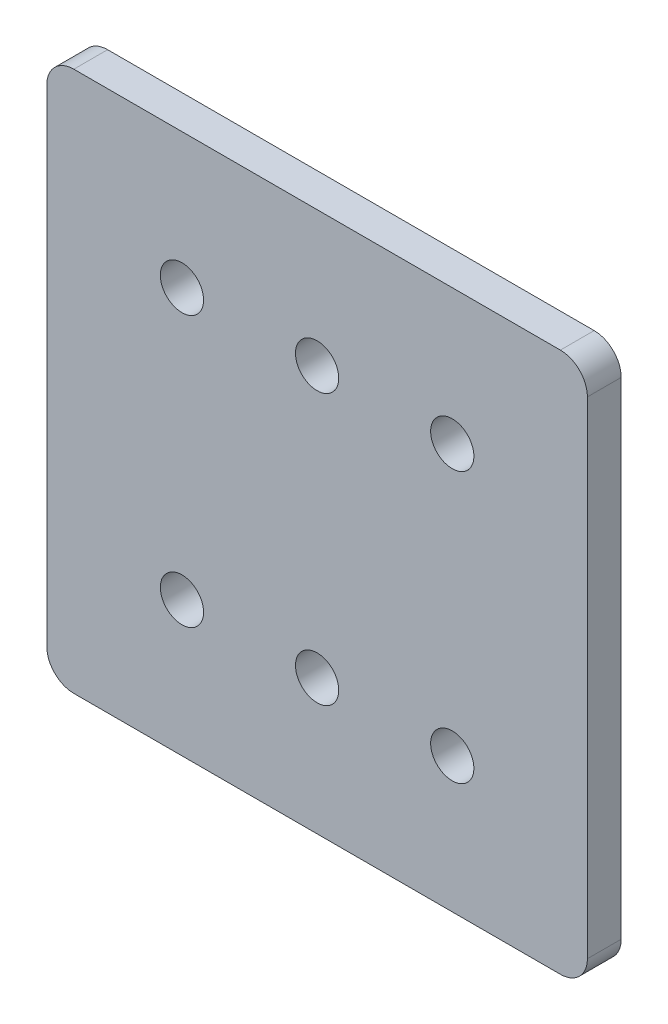
ISO-10303-21;
HEADER;
FILE_DESCRIPTION(('STEP AP214'),'2;1');
FILE_NAME('part.step','',(''),(''),'','','');
FILE_SCHEMA(('AUTOMOTIVE_DESIGN { 1 0 10303 214 1 1 1 1 }'));
ENDSEC;
DATA;
#1=APPLICATION_CONTEXT('core data for automotive mechanical design processes');
#2=APPLICATION_PROTOCOL_DEFINITION('international standard','automotive_design',2000,#1);
#3=PRODUCT_CONTEXT('',#1,'mechanical');
#4=PRODUCT('Part','Part','',(#3));
#5=PRODUCT_RELATED_PRODUCT_CATEGORY('part','',(#4));
#6=PRODUCT_DEFINITION_FORMATION('','',#4);
#7=PRODUCT_DEFINITION_CONTEXT('part definition',#1,'design');
#8=PRODUCT_DEFINITION('design','',#6,#7);
#9=PRODUCT_DEFINITION_SHAPE('','',#8);
#10=(LENGTH_UNIT() NAMED_UNIT(*) SI_UNIT(.MILLI.,.METRE.));
#11=(NAMED_UNIT(*) PLANE_ANGLE_UNIT() SI_UNIT($,.RADIAN.));
#12=(NAMED_UNIT(*) SI_UNIT($,.STERADIAN.) SOLID_ANGLE_UNIT());
#13=UNCERTAINTY_MEASURE_WITH_UNIT(LENGTH_MEASURE(1.E-05),#10,'distance_accuracy_value','');
#14=(GEOMETRIC_REPRESENTATION_CONTEXT(3) GLOBAL_UNCERTAINTY_ASSIGNED_CONTEXT((#13)) GLOBAL_UNIT_ASSIGNED_CONTEXT((#10,
#11,#12)) REPRESENTATION_CONTEXT('',''));
#15=CARTESIAN_POINT('',(0.,0.,0.));
#16=DIRECTION('',(0.,0.,1.));
#17=DIRECTION('',(1.,0.,0.));
#18=AXIS2_PLACEMENT_3D('',#15,#16,#17);
#19=CARTESIAN_POINT('',(25.4,-25.4,1.5875));
#20=DIRECTION('',(-1.,0.,0.));
#21=DIRECTION('',(0.,0.,1.));
#22=AXIS2_PLACEMENT_3D('',#19,#20,#21);
#23=PLANE('',#22);
#24=DIRECTION('',(0.,1.,0.));
#25=VECTOR('',#24,1.);
#26=CARTESIAN_POINT('',(25.4,-25.4,1.5875));
#27=LINE('',#26,#25);
#28=CARTESIAN_POINT('',(25.4,-22.86,1.5875));
#29=VERTEX_POINT('',#28);
#30=CARTESIAN_POINT('',(25.4,22.86,1.5875));
#31=VERTEX_POINT('',#30);
#32=EDGE_CURVE('E126',#29,#31,#27,.T.);
#33=ORIENTED_EDGE('',*,*,#32,.F.);
#34=DIRECTION('',(0.,0.,-1.));
#35=VECTOR('',#34,1.);
#36=CARTESIAN_POINT('',(25.4,-22.86,1.5875));
#37=LINE('',#36,#35);
#38=CARTESIAN_POINT('',(25.4,-22.86,-1.5875));
#39=VERTEX_POINT('',#38);
#40=EDGE_CURVE('E110',#29,#39,#37,.T.);
#41=ORIENTED_EDGE('',*,*,#40,.T.);
#42=DIRECTION('',(0.,1.,0.));
#43=VECTOR('',#42,1.);
#44=CARTESIAN_POINT('',(25.4,-25.4,-1.5875));
#45=LINE('',#44,#43);
#46=CARTESIAN_POINT('',(25.4,22.86,-1.5875));
#47=VERTEX_POINT('',#46);
#48=EDGE_CURVE('E123',#39,#47,#45,.T.);
#49=ORIENTED_EDGE('',*,*,#48,.T.);
#50=DIRECTION('',(0.,0.,-1.));
#51=VECTOR('',#50,1.);
#52=CARTESIAN_POINT('',(25.4,22.86,1.5875));
#53=LINE('',#52,#51);
#54=EDGE_CURVE('E129',#47,#31,#53,.F.);
#55=ORIENTED_EDGE('',*,*,#54,.T.);
#56=EDGE_LOOP('',(#33,#41,#49,#55));
#57=FACE_BOUND('',#56,.T.);
#58=ADVANCED_FACE('F38',(#57),#23,.F.);
#59=CARTESIAN_POINT('',(-25.4,25.4,1.5875));
#60=DIRECTION('',(0.,-1.,0.));
#61=DIRECTION('',(0.,0.,-1.));
#62=AXIS2_PLACEMENT_3D('',#59,#60,#61);
#63=PLANE('',#62);
#64=DIRECTION('',(-1.,0.,0.));
#65=VECTOR('',#64,1.);
#66=CARTESIAN_POINT('',(-25.4,25.4,1.5875));
#67=LINE('',#66,#65);
#68=CARTESIAN_POINT('',(22.86,25.4,1.5875));
#69=VERTEX_POINT('',#68);
#70=CARTESIAN_POINT('',(-22.86,25.4,1.5875));
#71=VERTEX_POINT('',#70);
#72=EDGE_CURVE('E189',#69,#71,#67,.T.);
#73=ORIENTED_EDGE('',*,*,#72,.F.);
#74=DIRECTION('',(0.,0.,-1.));
#75=VECTOR('',#74,1.);
#76=CARTESIAN_POINT('',(22.86,25.4,1.5875));
#77=LINE('',#76,#75);
#78=CARTESIAN_POINT('',(22.86,25.4,-1.5875));
#79=VERTEX_POINT('',#78);
#80=EDGE_CURVE('E11',#69,#79,#77,.T.);
#81=ORIENTED_EDGE('',*,*,#80,.T.);
#82=DIRECTION('',(-1.,0.,0.));
#83=VECTOR('',#82,1.);
#84=CARTESIAN_POINT('',(-25.4,25.4,-1.5875));
#85=LINE('',#84,#83);
#86=CARTESIAN_POINT('',(-22.86,25.4,-1.5875));
#87=VERTEX_POINT('',#86);
#88=EDGE_CURVE('E135',#79,#87,#85,.T.);
#89=ORIENTED_EDGE('',*,*,#88,.T.);
#90=DIRECTION('',(0.,0.,-1.));
#91=VECTOR('',#90,1.);
#92=CARTESIAN_POINT('',(-22.86,25.4,1.5875));
#93=LINE('',#92,#91);
#94=EDGE_CURVE('E47',#87,#71,#93,.F.);
#95=ORIENTED_EDGE('',*,*,#94,.T.);
#96=EDGE_LOOP('',(#73,#81,#89,#95));
#97=FACE_BOUND('',#96,.T.);
#98=ADVANCED_FACE('F188',(#97),#63,.F.);
#99=CARTESIAN_POINT('',(-25.4,-25.4,1.5875));
#100=DIRECTION('',(1.,0.,0.));
#101=DIRECTION('',(0.,0.,-1.));
#102=AXIS2_PLACEMENT_3D('',#99,#100,#101);
#103=PLANE('',#102);
#104=DIRECTION('',(0.,-1.,0.));
#105=VECTOR('',#104,1.);
#106=CARTESIAN_POINT('',(-25.4,-25.4,-1.5875));
#107=LINE('',#106,#105);
#108=CARTESIAN_POINT('',(-25.4,22.86,-1.5875));
#109=VERTEX_POINT('',#108);
#110=CARTESIAN_POINT('',(-25.4,-22.86,-1.5875));
#111=VERTEX_POINT('',#110);
#112=EDGE_CURVE('E141',#109,#111,#107,.T.);
#113=ORIENTED_EDGE('',*,*,#112,.T.);
#114=DIRECTION('',(0.,0.,-1.));
#115=VECTOR('',#114,1.);
#116=CARTESIAN_POINT('',(-25.4,-22.86,1.5875));
#117=LINE('',#116,#115);
#118=CARTESIAN_POINT('',(-25.4,-22.86,1.5875));
#119=VERTEX_POINT('',#118);
#120=EDGE_CURVE('E54',#111,#119,#117,.F.);
#121=ORIENTED_EDGE('',*,*,#120,.T.);
#122=DIRECTION('',(0.,-1.,0.));
#123=VECTOR('',#122,1.);
#124=CARTESIAN_POINT('',(-25.4,-25.4,1.5875));
#125=LINE('',#124,#123);
#126=CARTESIAN_POINT('',(-25.4,22.86,1.5875));
#127=VERTEX_POINT('',#126);
#128=EDGE_CURVE('E196',#127,#119,#125,.T.);
#129=ORIENTED_EDGE('',*,*,#128,.F.);
#130=DIRECTION('',(0.,0.,-1.));
#131=VECTOR('',#130,1.);
#132=CARTESIAN_POINT('',(-25.4,22.86,1.5875));
#133=LINE('',#132,#131);
#134=EDGE_CURVE('E179',#127,#109,#133,.T.);
#135=ORIENTED_EDGE('',*,*,#134,.T.);
#136=EDGE_LOOP('',(#113,#121,#129,#135));
#137=FACE_BOUND('',#136,.T.);
#138=ADVANCED_FACE('F200',(#137),#103,.F.);
#139=CARTESIAN_POINT('',(-25.4,-25.4,1.5875));
#140=DIRECTION('',(0.,1.,0.));
#141=DIRECTION('',(0.,0.,1.));
#142=AXIS2_PLACEMENT_3D('',#139,#140,#141);
#143=PLANE('',#142);
#144=DIRECTION('',(1.,0.,0.));
#145=VECTOR('',#144,1.);
#146=CARTESIAN_POINT('',(-25.4,-25.4,-1.5875));
#147=LINE('',#146,#145);
#148=CARTESIAN_POINT('',(-22.86,-25.4,-1.5875));
#149=VERTEX_POINT('',#148);
#150=CARTESIAN_POINT('',(22.86,-25.4,-1.5875));
#151=VERTEX_POINT('',#150);
#152=EDGE_CURVE('E152',#149,#151,#147,.T.);
#153=ORIENTED_EDGE('',*,*,#152,.T.);
#154=DIRECTION('',(0.,0.,-1.));
#155=VECTOR('',#154,1.);
#156=CARTESIAN_POINT('',(22.86,-25.4,1.5875));
#157=LINE('',#156,#155);
#158=CARTESIAN_POINT('',(22.86,-25.4,1.5875));
#159=VERTEX_POINT('',#158);
#160=EDGE_CURVE('E111',#151,#159,#157,.F.);
#161=ORIENTED_EDGE('',*,*,#160,.T.);
#162=DIRECTION('',(1.,0.,0.));
#163=VECTOR('',#162,1.);
#164=CARTESIAN_POINT('',(-25.4,-25.4,1.5875));
#165=LINE('',#164,#163);
#166=CARTESIAN_POINT('',(-22.86,-25.4,1.5875));
#167=VERTEX_POINT('',#166);
#168=EDGE_CURVE('E147',#167,#159,#165,.T.);
#169=ORIENTED_EDGE('',*,*,#168,.F.);
#170=DIRECTION('',(0.,0.,-1.));
#171=VECTOR('',#170,1.);
#172=CARTESIAN_POINT('',(-22.86,-25.4,1.5875));
#173=LINE('',#172,#171);
#174=EDGE_CURVE('E117',#167,#149,#173,.T.);
#175=ORIENTED_EDGE('',*,*,#174,.T.);
#176=EDGE_LOOP('',(#153,#161,#169,#175));
#177=FACE_BOUND('',#176,.T.);
#178=ADVANCED_FACE('F207',(#177),#143,.F.);
#179=CARTESIAN_POINT('',(0.,0.,1.5875));
#180=DIRECTION('',(0.,0.,-1.));
#181=DIRECTION('',(-1.,0.,0.));
#182=AXIS2_PLACEMENT_3D('',#179,#180,#181);
#183=PLANE('',#182);
#184=CARTESIAN_POINT('',(-12.7,-12.7,1.5875));
#185=DIRECTION('',(0.,0.,1.));
#186=DIRECTION('',(-1.,0.,0.));
#187=AXIS2_PLACEMENT_3D('',#184,#185,#186);
#188=CIRCLE('',#187,2.032);
#189=CARTESIAN_POINT('',(-14.732,-12.7,1.5875));
#190=VERTEX_POINT('',#189);
#191=EDGE_CURVE('E217',#190,#190,#188,.T.);
#192=ORIENTED_EDGE('',*,*,#191,.F.);
#193=EDGE_LOOP('',(#192));
#194=FACE_BOUND('',#193,.T.);
#195=CARTESIAN_POINT('',(0.,-12.7,1.5875));
#196=DIRECTION('',(0.,0.,1.));
#197=DIRECTION('',(-1.,0.,0.));
#198=AXIS2_PLACEMENT_3D('',#195,#196,#197);
#199=CIRCLE('',#198,2.032);
#200=CARTESIAN_POINT('',(-2.03200000000001,-12.7,1.5875));
#201=VERTEX_POINT('',#200);
#202=EDGE_CURVE('E225',#201,#201,#199,.T.);
#203=ORIENTED_EDGE('',*,*,#202,.F.);
#204=EDGE_LOOP('',(#203));
#205=FACE_BOUND('',#204,.T.);
#206=CARTESIAN_POINT('',(12.7,-12.7,1.5875));
#207=DIRECTION('',(0.,0.,1.));
#208=DIRECTION('',(-1.,0.,0.));
#209=AXIS2_PLACEMENT_3D('',#206,#207,#208);
#210=CIRCLE('',#209,2.032);
#211=CARTESIAN_POINT('',(10.668,-12.7,1.5875));
#212=VERTEX_POINT('',#211);
#213=EDGE_CURVE('E233',#212,#212,#210,.T.);
#214=ORIENTED_EDGE('',*,*,#213,.F.);
#215=EDGE_LOOP('',(#214));
#216=FACE_BOUND('',#215,.T.);
#217=CARTESIAN_POINT('',(12.7,12.7,1.5875));
#218=DIRECTION('',(0.,0.,1.));
#219=DIRECTION('',(1.,0.,0.));
#220=AXIS2_PLACEMENT_3D('',#217,#218,#219);
#221=CIRCLE('',#220,2.032);
#222=CARTESIAN_POINT('',(14.732,12.7,1.5875));
#223=VERTEX_POINT('',#222);
#224=EDGE_CURVE('E241',#223,#223,#221,.T.);
#225=ORIENTED_EDGE('',*,*,#224,.F.);
#226=EDGE_LOOP('',(#225));
#227=FACE_BOUND('',#226,.T.);
#228=CARTESIAN_POINT('',(0.,12.7,1.5875));
#229=DIRECTION('',(0.,0.,1.));
#230=DIRECTION('',(1.,0.,0.));
#231=AXIS2_PLACEMENT_3D('',#228,#229,#230);
#232=CIRCLE('',#231,2.032);
#233=CARTESIAN_POINT('',(2.03199999999999,12.7,1.5875));
#234=VERTEX_POINT('',#233);
#235=EDGE_CURVE('E249',#234,#234,#232,.T.);
#236=ORIENTED_EDGE('',*,*,#235,.F.);
#237=EDGE_LOOP('',(#236));
#238=FACE_BOUND('',#237,.T.);
#239=CARTESIAN_POINT('',(-12.7,12.7,1.5875));
#240=DIRECTION('',(0.,0.,1.));
#241=DIRECTION('',(1.,0.,0.));
#242=AXIS2_PLACEMENT_3D('',#239,#240,#241);
#243=CIRCLE('',#242,2.032);
#244=CARTESIAN_POINT('',(-10.668,12.7,1.5875));
#245=VERTEX_POINT('',#244);
#246=EDGE_CURVE('E144',#245,#245,#243,.T.);
#247=ORIENTED_EDGE('',*,*,#246,.F.);
#248=EDGE_LOOP('',(#247));
#249=FACE_BOUND('',#248,.T.);
#250=ORIENTED_EDGE('',*,*,#168,.T.);
#251=CARTESIAN_POINT('',(22.86,-22.86,1.5875));
#252=DIRECTION('',(0.,0.,-1.));
#253=DIRECTION('',(-1.,0.,0.));
#254=AXIS2_PLACEMENT_3D('',#251,#252,#253);
#255=CIRCLE('',#254,2.54);
#256=EDGE_CURVE('E176',#159,#29,#255,.F.);
#257=ORIENTED_EDGE('',*,*,#256,.T.);
#258=ORIENTED_EDGE('',*,*,#32,.T.);
#259=CARTESIAN_POINT('',(22.86,22.86,1.5875));
#260=DIRECTION('',(0.,0.,-1.));
#261=DIRECTION('',(-1.,0.,0.));
#262=AXIS2_PLACEMENT_3D('',#259,#260,#261);
#263=CIRCLE('',#262,2.54);
#264=EDGE_CURVE('E170',#31,#69,#263,.F.);
#265=ORIENTED_EDGE('',*,*,#264,.T.);
#266=ORIENTED_EDGE('',*,*,#72,.T.);
#267=CARTESIAN_POINT('',(-22.86,22.86,1.5875));
#268=DIRECTION('',(0.,0.,-1.));
#269=DIRECTION('',(-1.,0.,0.));
#270=AXIS2_PLACEMENT_3D('',#267,#268,#269);
#271=CIRCLE('',#270,2.54);
#272=EDGE_CURVE('E61',#71,#127,#271,.F.);
#273=ORIENTED_EDGE('',*,*,#272,.T.);
#274=ORIENTED_EDGE('',*,*,#128,.T.);
#275=CARTESIAN_POINT('',(-22.86,-22.86,1.5875));
#276=DIRECTION('',(0.,0.,-1.));
#277=DIRECTION('',(-1.,0.,0.));
#278=AXIS2_PLACEMENT_3D('',#275,#276,#277);
#279=CIRCLE('',#278,2.54);
#280=EDGE_CURVE('E173',#119,#167,#279,.F.);
#281=ORIENTED_EDGE('',*,*,#280,.T.);
#282=EDGE_LOOP('',(#250,#257,#258,#265,#266,#273,#274,#281));
#283=FACE_BOUND('',#282,.T.);
#284=ADVANCED_FACE('F193',(#194,#205,#216,#227,#238,#249,#283),#183,.F.);
#285=CARTESIAN_POINT('',(0.,0.,-1.5875));
#286=DIRECTION('',(0.,0.,-1.));
#287=DIRECTION('',(-1.,0.,0.));
#288=AXIS2_PLACEMENT_3D('',#285,#286,#287);
#289=PLANE('',#288);
#290=CARTESIAN_POINT('',(-12.7,-12.7,-1.5875));
#291=DIRECTION('',(0.,0.,1.));
#292=DIRECTION('',(-1.,0.,0.));
#293=AXIS2_PLACEMENT_3D('',#290,#291,#292);
#294=CIRCLE('',#293,2.032);
#295=CARTESIAN_POINT('',(-14.732,-12.7,-1.5875));
#296=VERTEX_POINT('',#295);
#297=EDGE_CURVE('E221',#296,#296,#294,.T.);
#298=ORIENTED_EDGE('',*,*,#297,.T.);
#299=EDGE_LOOP('',(#298));
#300=FACE_BOUND('',#299,.T.);
#301=CARTESIAN_POINT('',(0.,-12.7,-1.5875));
#302=DIRECTION('',(0.,0.,1.));
#303=DIRECTION('',(-1.,0.,0.));
#304=AXIS2_PLACEMENT_3D('',#301,#302,#303);
#305=CIRCLE('',#304,2.032);
#306=CARTESIAN_POINT('',(-2.03200000000001,-12.7,-1.5875));
#307=VERTEX_POINT('',#306);
#308=EDGE_CURVE('E229',#307,#307,#305,.T.);
#309=ORIENTED_EDGE('',*,*,#308,.T.);
#310=EDGE_LOOP('',(#309));
#311=FACE_BOUND('',#310,.T.);
#312=CARTESIAN_POINT('',(12.7,-12.7,-1.5875));
#313=DIRECTION('',(0.,0.,1.));
#314=DIRECTION('',(-1.,0.,0.));
#315=AXIS2_PLACEMENT_3D('',#312,#313,#314);
#316=CIRCLE('',#315,2.032);
#317=CARTESIAN_POINT('',(10.668,-12.7,-1.5875));
#318=VERTEX_POINT('',#317);
#319=EDGE_CURVE('E237',#318,#318,#316,.T.);
#320=ORIENTED_EDGE('',*,*,#319,.T.);
#321=EDGE_LOOP('',(#320));
#322=FACE_BOUND('',#321,.T.);
#323=CARTESIAN_POINT('',(12.7,12.7,-1.5875));
#324=DIRECTION('',(0.,0.,1.));
#325=DIRECTION('',(1.,0.,0.));
#326=AXIS2_PLACEMENT_3D('',#323,#324,#325);
#327=CIRCLE('',#326,2.032);
#328=CARTESIAN_POINT('',(14.732,12.7,-1.5875));
#329=VERTEX_POINT('',#328);
#330=EDGE_CURVE('E245',#329,#329,#327,.T.);
#331=ORIENTED_EDGE('',*,*,#330,.T.);
#332=EDGE_LOOP('',(#331));
#333=FACE_BOUND('',#332,.T.);
#334=CARTESIAN_POINT('',(0.,12.7,-1.5875));
#335=DIRECTION('',(0.,0.,1.));
#336=DIRECTION('',(1.,0.,0.));
#337=AXIS2_PLACEMENT_3D('',#334,#335,#336);
#338=CIRCLE('',#337,2.032);
#339=CARTESIAN_POINT('',(2.03199999999999,12.7,-1.5875));
#340=VERTEX_POINT('',#339);
#341=EDGE_CURVE('E215',#340,#340,#338,.T.);
#342=ORIENTED_EDGE('',*,*,#341,.T.);
#343=EDGE_LOOP('',(#342));
#344=FACE_BOUND('',#343,.T.);
#345=CARTESIAN_POINT('',(-12.7,12.7,-1.5875));
#346=DIRECTION('',(0.,0.,1.));
#347=DIRECTION('',(1.,0.,0.));
#348=AXIS2_PLACEMENT_3D('',#345,#346,#347);
#349=CIRCLE('',#348,2.032);
#350=CARTESIAN_POINT('',(-10.668,12.7,-1.5875));
#351=VERTEX_POINT('',#350);
#352=EDGE_CURVE('E136',#351,#351,#349,.T.);
#353=ORIENTED_EDGE('',*,*,#352,.T.);
#354=EDGE_LOOP('',(#353));
#355=FACE_BOUND('',#354,.T.);
#356=ORIENTED_EDGE('',*,*,#48,.F.);
#357=CARTESIAN_POINT('',(22.86,-22.86,-1.5875));
#358=DIRECTION('',(0.,0.,-1.));
#359=DIRECTION('',(-1.,0.,0.));
#360=AXIS2_PLACEMENT_3D('',#357,#358,#359);
#361=CIRCLE('',#360,2.54);
#362=EDGE_CURVE('E106',#39,#151,#361,.T.);
#363=ORIENTED_EDGE('',*,*,#362,.T.);
#364=ORIENTED_EDGE('',*,*,#152,.F.);
#365=CARTESIAN_POINT('',(-22.86,-22.86,-1.5875));
#366=DIRECTION('',(0.,0.,-1.));
#367=DIRECTION('',(-1.,0.,0.));
#368=AXIS2_PLACEMENT_3D('',#365,#366,#367);
#369=CIRCLE('',#368,2.54);
#370=EDGE_CURVE('E118',#149,#111,#369,.T.);
#371=ORIENTED_EDGE('',*,*,#370,.T.);
#372=ORIENTED_EDGE('',*,*,#112,.F.);
#373=CARTESIAN_POINT('',(-22.86,22.86,-1.5875));
#374=DIRECTION('',(0.,0.,-1.));
#375=DIRECTION('',(-1.,0.,0.));
#376=AXIS2_PLACEMENT_3D('',#373,#374,#375);
#377=CIRCLE('',#376,2.54);
#378=EDGE_CURVE('E128',#109,#87,#377,.T.);
#379=ORIENTED_EDGE('',*,*,#378,.T.);
#380=ORIENTED_EDGE('',*,*,#88,.F.);
#381=CARTESIAN_POINT('',(22.86,22.86,-1.5875));
#382=DIRECTION('',(0.,0.,-1.));
#383=DIRECTION('',(-1.,0.,0.));
#384=AXIS2_PLACEMENT_3D('',#381,#382,#383);
#385=CIRCLE('',#384,2.54);
#386=EDGE_CURVE('E133',#79,#47,#385,.T.);
#387=ORIENTED_EDGE('',*,*,#386,.T.);
#388=EDGE_LOOP('',(#356,#363,#364,#371,#372,#379,#380,#387));
#389=FACE_BOUND('',#388,.T.);
#390=ADVANCED_FACE('F131',(#300,#311,#322,#333,#344,#355,#389),#289,.T.);
#391=CARTESIAN_POINT('',(22.86,-22.86,1.5875));
#392=DIRECTION('',(0.,0.,-1.));
#393=DIRECTION('',(-1.,0.,0.));
#394=AXIS2_PLACEMENT_3D('',#391,#392,#393);
#395=CYLINDRICAL_SURFACE('',#394,2.54);
#396=ORIENTED_EDGE('',*,*,#256,.F.);
#397=ORIENTED_EDGE('',*,*,#160,.F.);
#398=ORIENTED_EDGE('',*,*,#362,.F.);
#399=ORIENTED_EDGE('',*,*,#40,.F.);
#400=EDGE_LOOP('',(#396,#397,#398,#399));
#401=FACE_BOUND('',#400,.T.);
#402=ADVANCED_FACE('F109',(#401),#395,.T.);
#403=CARTESIAN_POINT('',(-22.86,-22.86,1.5875));
#404=DIRECTION('',(0.,0.,-1.));
#405=DIRECTION('',(-1.,0.,0.));
#406=AXIS2_PLACEMENT_3D('',#403,#404,#405);
#407=CYLINDRICAL_SURFACE('',#406,2.54);
#408=ORIENTED_EDGE('',*,*,#280,.F.);
#409=ORIENTED_EDGE('',*,*,#120,.F.);
#410=ORIENTED_EDGE('',*,*,#370,.F.);
#411=ORIENTED_EDGE('',*,*,#174,.F.);
#412=EDGE_LOOP('',(#408,#409,#410,#411));
#413=FACE_BOUND('',#412,.T.);
#414=ADVANCED_FACE('F204',(#413),#407,.T.);
#415=CARTESIAN_POINT('',(22.86,22.86,1.5875));
#416=DIRECTION('',(0.,0.,-1.));
#417=DIRECTION('',(-1.,0.,0.));
#418=AXIS2_PLACEMENT_3D('',#415,#416,#417);
#419=CYLINDRICAL_SURFACE('',#418,2.54);
#420=ORIENTED_EDGE('',*,*,#264,.F.);
#421=ORIENTED_EDGE('',*,*,#54,.F.);
#422=ORIENTED_EDGE('',*,*,#386,.F.);
#423=ORIENTED_EDGE('',*,*,#80,.F.);
#424=EDGE_LOOP('',(#420,#421,#422,#423));
#425=FACE_BOUND('',#424,.T.);
#426=ADVANCED_FACE('F279',(#425),#419,.T.);
#427=CARTESIAN_POINT('',(-22.86,22.86,1.5875));
#428=DIRECTION('',(0.,0.,-1.));
#429=DIRECTION('',(-1.,0.,0.));
#430=AXIS2_PLACEMENT_3D('',#427,#428,#429);
#431=CYLINDRICAL_SURFACE('',#430,2.54);
#432=ORIENTED_EDGE('',*,*,#272,.F.);
#433=ORIENTED_EDGE('',*,*,#94,.F.);
#434=ORIENTED_EDGE('',*,*,#378,.F.);
#435=ORIENTED_EDGE('',*,*,#134,.F.);
#436=EDGE_LOOP('',(#432,#433,#434,#435));
#437=FACE_BOUND('',#436,.T.);
#438=ADVANCED_FACE('F40',(#437),#431,.T.);
#439=CARTESIAN_POINT('',(-12.7,12.7,-1.5875));
#440=DIRECTION('',(0.,0.,1.));
#441=DIRECTION('',(1.,0.,0.));
#442=AXIS2_PLACEMENT_3D('',#439,#440,#441);
#443=CYLINDRICAL_SURFACE('',#442,2.032);
#444=ORIENTED_EDGE('',*,*,#352,.F.);
#445=EDGE_LOOP('',(#444));
#446=FACE_BOUND('',#445,.T.);
#447=ORIENTED_EDGE('',*,*,#246,.T.);
#448=EDGE_LOOP('',(#447));
#449=FACE_BOUND('',#448,.T.);
#450=ADVANCED_FACE('F263',(#446,#449),#443,.F.);
#451=CARTESIAN_POINT('',(0.,12.7,-1.5875));
#452=DIRECTION('',(0.,0.,1.));
#453=DIRECTION('',(1.,0.,0.));
#454=AXIS2_PLACEMENT_3D('',#451,#452,#453);
#455=CYLINDRICAL_SURFACE('',#454,2.032);
#456=ORIENTED_EDGE('',*,*,#341,.F.);
#457=EDGE_LOOP('',(#456));
#458=FACE_BOUND('',#457,.T.);
#459=ORIENTED_EDGE('',*,*,#235,.T.);
#460=EDGE_LOOP('',(#459));
#461=FACE_BOUND('',#460,.T.);
#462=ADVANCED_FACE('F259',(#458,#461),#455,.F.);
#463=CARTESIAN_POINT('',(12.7,12.7,-1.5875));
#464=DIRECTION('',(0.,0.,1.));
#465=DIRECTION('',(1.,0.,0.));
#466=AXIS2_PLACEMENT_3D('',#463,#464,#465);
#467=CYLINDRICAL_SURFACE('',#466,2.032);
#468=ORIENTED_EDGE('',*,*,#330,.F.);
#469=EDGE_LOOP('',(#468));
#470=FACE_BOUND('',#469,.T.);
#471=ORIENTED_EDGE('',*,*,#224,.T.);
#472=EDGE_LOOP('',(#471));
#473=FACE_BOUND('',#472,.T.);
#474=ADVANCED_FACE('F262',(#470,#473),#467,.F.);
#475=CARTESIAN_POINT('',(12.7,-12.7,-1.5875));
#476=DIRECTION('',(0.,0.,1.));
#477=DIRECTION('',(1.,0.,0.));
#478=AXIS2_PLACEMENT_3D('',#475,#476,#477);
#479=CYLINDRICAL_SURFACE('',#478,2.032);
#480=ORIENTED_EDGE('',*,*,#319,.F.);
#481=EDGE_LOOP('',(#480));
#482=FACE_BOUND('',#481,.T.);
#483=ORIENTED_EDGE('',*,*,#213,.T.);
#484=EDGE_LOOP('',(#483));
#485=FACE_BOUND('',#484,.T.);
#486=ADVANCED_FACE('F334',(#482,#485),#479,.F.);
#487=CARTESIAN_POINT('',(0.,-12.7,-1.5875));
#488=DIRECTION('',(0.,0.,1.));
#489=DIRECTION('',(1.,0.,0.));
#490=AXIS2_PLACEMENT_3D('',#487,#488,#489);
#491=CYLINDRICAL_SURFACE('',#490,2.032);
#492=ORIENTED_EDGE('',*,*,#308,.F.);
#493=EDGE_LOOP('',(#492));
#494=FACE_BOUND('',#493,.T.);
#495=ORIENTED_EDGE('',*,*,#202,.T.);
#496=EDGE_LOOP('',(#495));
#497=FACE_BOUND('',#496,.T.);
#498=ADVANCED_FACE('F344',(#494,#497),#491,.F.);
#499=CARTESIAN_POINT('',(-12.7,-12.7,-1.5875));
#500=DIRECTION('',(0.,0.,1.));
#501=DIRECTION('',(1.,0.,0.));
#502=AXIS2_PLACEMENT_3D('',#499,#500,#501);
#503=CYLINDRICAL_SURFACE('',#502,2.032);
#504=ORIENTED_EDGE('',*,*,#297,.F.);
#505=EDGE_LOOP('',(#504));
#506=FACE_BOUND('',#505,.T.);
#507=ORIENTED_EDGE('',*,*,#191,.T.);
#508=EDGE_LOOP('',(#507));
#509=FACE_BOUND('',#508,.T.);
#510=ADVANCED_FACE('F354',(#506,#509),#503,.F.);
#511=CLOSED_SHELL('',(#58,#98,#138,#178,#284,#390,#402,#414,#426,#438,#450,#462,#474,#486,#498,#510));
#512=MANIFOLD_SOLID_BREP('B2',#511);
#513=ADVANCED_BREP_SHAPE_REPRESENTATION('',(#18,#512),#14);
#514=SHAPE_DEFINITION_REPRESENTATION(#9,#513);
ENDSEC;
END-ISO-10303-21;
